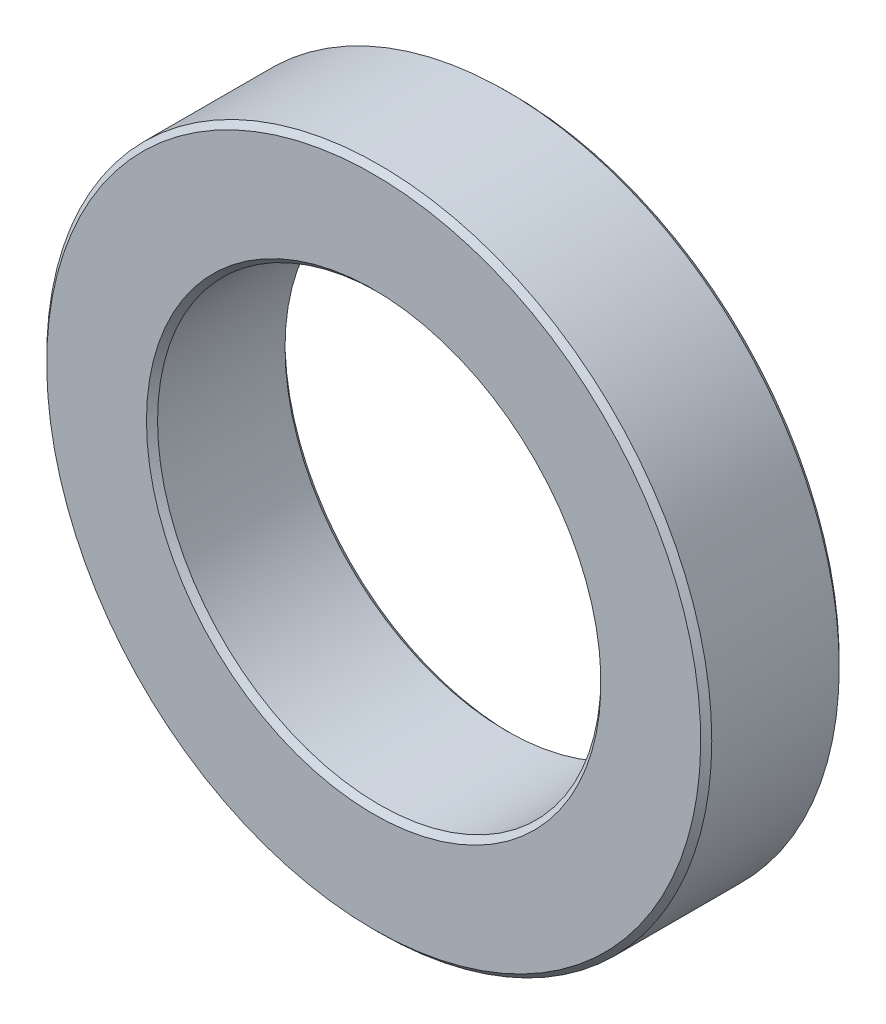
ISO-10303-21;
HEADER;
FILE_DESCRIPTION(('STEP AP214'),'2;1');
FILE_NAME('part.step','',(''),(''),'','','');
FILE_SCHEMA(('AUTOMOTIVE_DESIGN { 1 0 10303 214 1 1 1 1 }'));
ENDSEC;
DATA;
#1=APPLICATION_CONTEXT('core data for automotive mechanical design processes');
#2=APPLICATION_PROTOCOL_DEFINITION('international standard','automotive_design',2000,#1);
#3=PRODUCT_CONTEXT('',#1,'mechanical');
#4=PRODUCT('Part','Part','',(#3));
#5=PRODUCT_RELATED_PRODUCT_CATEGORY('part','',(#4));
#6=PRODUCT_DEFINITION_FORMATION('','',#4);
#7=PRODUCT_DEFINITION_CONTEXT('part definition',#1,'design');
#8=PRODUCT_DEFINITION('design','',#6,#7);
#9=PRODUCT_DEFINITION_SHAPE('','',#8);
#10=(LENGTH_UNIT() NAMED_UNIT(*) SI_UNIT(.MILLI.,.METRE.));
#11=(NAMED_UNIT(*) PLANE_ANGLE_UNIT() SI_UNIT($,.RADIAN.));
#12=(NAMED_UNIT(*) SI_UNIT($,.STERADIAN.) SOLID_ANGLE_UNIT());
#13=UNCERTAINTY_MEASURE_WITH_UNIT(LENGTH_MEASURE(1.E-05),#10,'distance_accuracy_value','');
#14=(GEOMETRIC_REPRESENTATION_CONTEXT(3) GLOBAL_UNCERTAINTY_ASSIGNED_CONTEXT((#13)) GLOBAL_UNIT_ASSIGNED_CONTEXT((#10,
#11,#12)) REPRESENTATION_CONTEXT('',''));
#15=CARTESIAN_POINT('',(0.,0.,0.));
#16=DIRECTION('',(0.,0.,1.));
#17=DIRECTION('',(1.,0.,0.));
#18=AXIS2_PLACEMENT_3D('',#15,#16,#17);
#19=CARTESIAN_POINT('',(0.,0.,0.09999999999999));
#20=DIRECTION('',(0.,0.,1.));
#21=DIRECTION('',(1.,0.,0.));
#22=AXIS2_PLACEMENT_3D('',#19,#20,#21);
#23=CONICAL_SURFACE('',#22,11.9,0.785398163397448);
#24=CARTESIAN_POINT('',(0.,0.,0.2));
#25=DIRECTION('',(0.,0.,-1.));
#26=DIRECTION('',(-1.,0.,0.));
#27=AXIS2_PLACEMENT_3D('',#24,#25,#26);
#28=CIRCLE('',#27,12.);
#29=CARTESIAN_POINT('',(-12.,0.,0.2));
#30=VERTEX_POINT('',#29);
#31=CARTESIAN_POINT('',(12.,0.,0.2));
#32=VERTEX_POINT('',#31);
#33=EDGE_CURVE('E21',#30,#32,#28,.T.);
#34=ORIENTED_EDGE('',*,*,#33,.T.);
#35=CARTESIAN_POINT('',(0.,0.,0.2));
#36=DIRECTION('',(0.,0.,-1.));
#37=DIRECTION('',(-1.,0.,0.));
#38=AXIS2_PLACEMENT_3D('',#35,#36,#37);
#39=CIRCLE('',#38,12.);
#40=EDGE_CURVE('E91',#32,#30,#39,.T.);
#41=ORIENTED_EDGE('',*,*,#40,.T.);
#42=DIRECTION('',(0.707106781186548,0.,-0.707106781186548));
#43=VECTOR('',#42,1.);
#44=CARTESIAN_POINT('',(-11.9,0.,0.09999999999999));
#45=LINE('',#44,#43);
#46=CARTESIAN_POINT('',(-11.8,0.,0.));
#47=VERTEX_POINT('',#46);
#48=EDGE_CURVE('E11',#30,#47,#45,.T.);
#49=ORIENTED_EDGE('',*,*,#48,.T.);
#50=CARTESIAN_POINT('',(0.,0.,0.));
#51=DIRECTION('',(0.,0.,-1.));
#52=DIRECTION('',(-1.,0.,0.));
#53=AXIS2_PLACEMENT_3D('',#50,#51,#52);
#54=CIRCLE('',#53,11.8);
#55=EDGE_CURVE('E28',#47,#47,#54,.T.);
#56=ORIENTED_EDGE('',*,*,#55,.F.);
#57=ORIENTED_EDGE('',*,*,#48,.F.);
#58=EDGE_LOOP('',(#34,#41,#49,#56,#57));
#59=FACE_BOUND('',#58,.T.);
#60=ADVANCED_FACE('F17',(#59),#23,.T.);
#61=CARTESIAN_POINT('',(-11.9416,-11.98269068,0.));
#62=DIRECTION('',(0.,0.,1.));
#63=DIRECTION('',(1.,0.,0.));
#64=AXIS2_PLACEMENT_3D('',#61,#62,#63);
#65=PLANE('',#64);
#66=CARTESIAN_POINT('',(0.,0.,0.));
#67=DIRECTION('',(0.,0.,1.));
#68=DIRECTION('',(-1.,0.,0.));
#69=AXIS2_PLACEMENT_3D('',#66,#67,#68);
#70=CIRCLE('',#69,8.2);
#71=CARTESIAN_POINT('',(8.2,0.,0.));
#72=VERTEX_POINT('',#71);
#73=EDGE_CURVE('E112',#72,#72,#70,.T.);
#74=ORIENTED_EDGE('',*,*,#73,.T.);
#75=EDGE_LOOP('',(#74));
#76=FACE_BOUND('',#75,.T.);
#77=ORIENTED_EDGE('',*,*,#55,.T.);
#78=EDGE_LOOP('',(#77));
#79=FACE_BOUND('',#78,.T.);
#80=ADVANCED_FACE('F179',(#76,#79),#65,.F.);
#81=CARTESIAN_POINT('',(0.,0.,0.1));
#82=DIRECTION('',(0.,0.,-1.));
#83=DIRECTION('',(-1.,0.,0.));
#84=AXIS2_PLACEMENT_3D('',#81,#82,#83);
#85=CONICAL_SURFACE('',#84,8.1,0.785398163397448);
#86=CARTESIAN_POINT('',(0.,0.,0.2));
#87=DIRECTION('',(0.,0.,1.));
#88=DIRECTION('',(-1.,0.,0.));
#89=AXIS2_PLACEMENT_3D('',#86,#87,#88);
#90=CIRCLE('',#89,8.);
#91=CARTESIAN_POINT('',(8.,0.,0.2));
#92=VERTEX_POINT('',#91);
#93=CARTESIAN_POINT('',(-8.,0.,0.2));
#94=VERTEX_POINT('',#93);
#95=EDGE_CURVE('E114',#92,#94,#90,.T.);
#96=ORIENTED_EDGE('',*,*,#95,.T.);
#97=CARTESIAN_POINT('',(0.,0.,0.2));
#98=DIRECTION('',(0.,0.,1.));
#99=DIRECTION('',(-1.,0.,0.));
#100=AXIS2_PLACEMENT_3D('',#97,#98,#99);
#101=CIRCLE('',#100,8.);
#102=EDGE_CURVE('E117',#94,#92,#101,.T.);
#103=ORIENTED_EDGE('',*,*,#102,.T.);
#104=DIRECTION('',(0.707106781186548,0.,-0.707106781186548));
#105=VECTOR('',#104,1.);
#106=CARTESIAN_POINT('',(8.1,0.,0.1));
#107=LINE('',#106,#105);
#108=EDGE_CURVE('E127',#92,#72,#107,.T.);
#109=ORIENTED_EDGE('',*,*,#108,.T.);
#110=ORIENTED_EDGE('',*,*,#73,.F.);
#111=ORIENTED_EDGE('',*,*,#108,.F.);
#112=EDGE_LOOP('',(#96,#103,#109,#110,#111));
#113=FACE_BOUND('',#112,.T.);
#114=ADVANCED_FACE('F169',(#113),#85,.F.);
#115=CARTESIAN_POINT('',(0.,0.,0.2));
#116=DIRECTION('',(0.,0.,-1.));
#117=DIRECTION('',(1.,0.,0.));
#118=AXIS2_PLACEMENT_3D('',#115,#116,#117);
#119=CYLINDRICAL_SURFACE('',#118,8.);
#120=CARTESIAN_POINT('',(0.,0.,4.8));
#121=DIRECTION('',(0.,0.,-1.));
#122=DIRECTION('',(1.,0.,0.));
#123=AXIS2_PLACEMENT_3D('',#120,#121,#122);
#124=CIRCLE('',#123,8.);
#125=CARTESIAN_POINT('',(-8.,0.,4.8));
#126=VERTEX_POINT('',#125);
#127=EDGE_CURVE('E134',#126,#126,#124,.T.);
#128=ORIENTED_EDGE('',*,*,#127,.F.);
#129=DIRECTION('',(0.,0.,-1.));
#130=VECTOR('',#129,1.);
#131=CARTESIAN_POINT('',(-8.,0.,0.2));
#132=LINE('',#131,#130);
#133=EDGE_CURVE('E118',#126,#94,#132,.T.);
#134=ORIENTED_EDGE('',*,*,#133,.T.);
#135=ORIENTED_EDGE('',*,*,#95,.F.);
#136=ORIENTED_EDGE('',*,*,#102,.F.);
#137=ORIENTED_EDGE('',*,*,#133,.F.);
#138=EDGE_LOOP('',(#128,#134,#135,#136,#137));
#139=FACE_BOUND('',#138,.T.);
#140=ADVANCED_FACE('F170',(#139),#119,.F.);
#141=CARTESIAN_POINT('',(0.,0.,4.9));
#142=DIRECTION('',(0.,0.,1.));
#143=DIRECTION('',(1.,0.,0.));
#144=AXIS2_PLACEMENT_3D('',#141,#142,#143);
#145=CONICAL_SURFACE('',#144,8.1,0.785398163397448);
#146=ORIENTED_EDGE('',*,*,#127,.T.);
#147=DIRECTION('',(-0.707106781186548,0.,0.707106781186548));
#148=VECTOR('',#147,1.);
#149=CARTESIAN_POINT('',(-8.1,0.,4.9));
#150=LINE('',#149,#148);
#151=CARTESIAN_POINT('',(-8.2,0.,5.));
#152=VERTEX_POINT('',#151);
#153=EDGE_CURVE('E61',#126,#152,#150,.T.);
#154=ORIENTED_EDGE('',*,*,#153,.T.);
#155=CARTESIAN_POINT('',(0.,0.,5.));
#156=DIRECTION('',(0.,0.,-1.));
#157=DIRECTION('',(1.,0.,0.));
#158=AXIS2_PLACEMENT_3D('',#155,#156,#157);
#159=CIRCLE('',#158,8.2);
#160=EDGE_CURVE('E142',#152,#152,#159,.T.);
#161=ORIENTED_EDGE('',*,*,#160,.F.);
#162=ORIENTED_EDGE('',*,*,#153,.F.);
#163=EDGE_LOOP('',(#146,#154,#161,#162));
#164=FACE_BOUND('',#163,.T.);
#165=ADVANCED_FACE('F19',(#164),#145,.F.);
#166=CARTESIAN_POINT('',(-11.9416,-11.98269068,5.));
#167=DIRECTION('',(0.,0.,1.));
#168=DIRECTION('',(1.,0.,0.));
#169=AXIS2_PLACEMENT_3D('',#166,#167,#168);
#170=PLANE('',#169);
#171=ORIENTED_EDGE('',*,*,#160,.T.);
#172=EDGE_LOOP('',(#171));
#173=FACE_BOUND('',#172,.T.);
#174=CARTESIAN_POINT('',(0.,0.,5.));
#175=DIRECTION('',(0.,0.,1.));
#176=DIRECTION('',(0.,-1.,0.));
#177=AXIS2_PLACEMENT_3D('',#174,#175,#176);
#178=CIRCLE('',#177,11.8);
#179=CARTESIAN_POINT('',(0.,-11.8,5.));
#180=VERTEX_POINT('',#179);
#181=EDGE_CURVE('E72',#180,#180,#178,.T.);
#182=ORIENTED_EDGE('',*,*,#181,.T.);
#183=EDGE_LOOP('',(#182));
#184=FACE_BOUND('',#183,.T.);
#185=ADVANCED_FACE('F178',(#173,#184),#170,.T.);
#186=CARTESIAN_POINT('',(0.,0.,4.9));
#187=DIRECTION('',(0.,0.,-1.));
#188=DIRECTION('',(0.,1.,0.));
#189=AXIS2_PLACEMENT_3D('',#186,#187,#188);
#190=CONICAL_SURFACE('',#189,11.9,0.785398163397448);
#191=CARTESIAN_POINT('',(0.,0.,4.8));
#192=DIRECTION('',(0.,0.,1.));
#193=DIRECTION('',(0.,1.,0.));
#194=AXIS2_PLACEMENT_3D('',#191,#192,#193);
#195=CIRCLE('',#194,12.);
#196=CARTESIAN_POINT('',(12.,0.,4.8));
#197=VERTEX_POINT('',#196);
#198=CARTESIAN_POINT('',(0.,-12.,4.8));
#199=VERTEX_POINT('',#198);
#200=EDGE_CURVE('E103',#197,#199,#195,.T.);
#201=ORIENTED_EDGE('',*,*,#200,.T.);
#202=DIRECTION('',(0.,0.707106781186548,0.707106781186548));
#203=VECTOR('',#202,1.);
#204=CARTESIAN_POINT('',(0.,-11.9,4.9));
#205=LINE('',#204,#203);
#206=EDGE_CURVE('E140',#199,#180,#205,.T.);
#207=ORIENTED_EDGE('',*,*,#206,.T.);
#208=ORIENTED_EDGE('',*,*,#181,.F.);
#209=ORIENTED_EDGE('',*,*,#206,.F.);
#210=CARTESIAN_POINT('',(0.,0.,4.8));
#211=DIRECTION('',(0.,0.,1.));
#212=DIRECTION('',(0.,1.,0.));
#213=AXIS2_PLACEMENT_3D('',#210,#211,#212);
#214=CIRCLE('',#213,12.);
#215=EDGE_CURVE('E99',#199,#197,#214,.T.);
#216=ORIENTED_EDGE('',*,*,#215,.T.);
#217=EDGE_LOOP('',(#201,#207,#208,#209,#216));
#218=FACE_BOUND('',#217,.T.);
#219=ADVANCED_FACE('F189',(#218),#190,.T.);
#220=CARTESIAN_POINT('',(0.,0.,4.8));
#221=DIRECTION('',(0.,0.,1.));
#222=DIRECTION('',(-1.,0.,0.));
#223=AXIS2_PLACEMENT_3D('',#220,#221,#222);
#224=CYLINDRICAL_SURFACE('',#223,12.);
#225=ORIENTED_EDGE('',*,*,#200,.F.);
#226=DIRECTION('',(0.,0.,-1.));
#227=VECTOR('',#226,1.);
#228=CARTESIAN_POINT('',(12.,0.,4.8));
#229=LINE('',#228,#227);
#230=EDGE_CURVE('E97',#197,#32,#229,.T.);
#231=ORIENTED_EDGE('',*,*,#230,.T.);
#232=ORIENTED_EDGE('',*,*,#33,.F.);
#233=ORIENTED_EDGE('',*,*,#40,.F.);
#234=ORIENTED_EDGE('',*,*,#230,.F.);
#235=ORIENTED_EDGE('',*,*,#215,.F.);
#236=EDGE_LOOP('',(#225,#231,#232,#233,#234,#235));
#237=FACE_BOUND('',#236,.T.);
#238=ADVANCED_FACE('F94',(#237),#224,.T.);
#239=CLOSED_SHELL('',(#60,#80,#114,#140,#165,#185,#219,#238));
#240=MANIFOLD_SOLID_BREP('B1',#239);
#241=ADVANCED_BREP_SHAPE_REPRESENTATION('',(#18,#240),#14);
#242=SHAPE_DEFINITION_REPRESENTATION(#9,#241);
ENDSEC;
END-ISO-10303-21;
